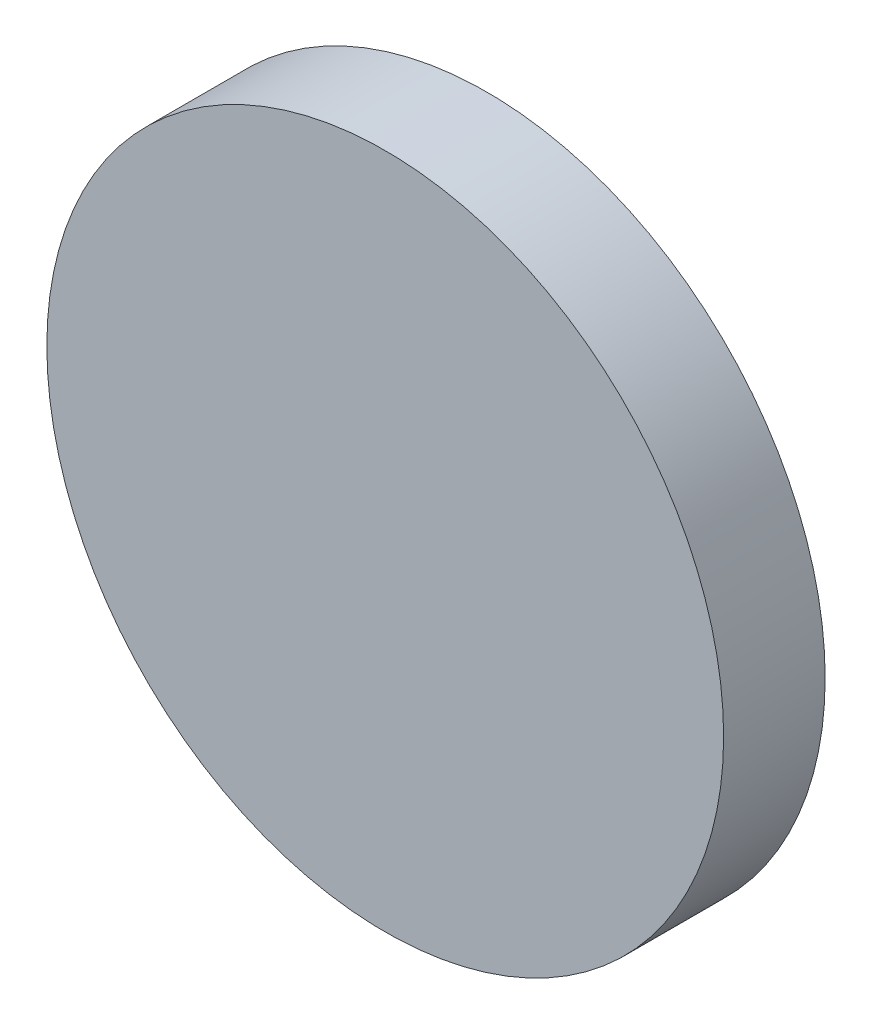
ISO-10303-21;
HEADER;
FILE_DESCRIPTION(('STEP AP214'),'2;1');
FILE_NAME('part.step','',(''),(''),'','','');
FILE_SCHEMA(('AUTOMOTIVE_DESIGN { 1 0 10303 214 1 1 1 1 }'));
ENDSEC;
DATA;
#1=APPLICATION_CONTEXT('core data for automotive mechanical design processes');
#2=APPLICATION_PROTOCOL_DEFINITION('international standard','automotive_design',2000,#1);
#3=PRODUCT_CONTEXT('',#1,'mechanical');
#4=PRODUCT('Part','Part','',(#3));
#5=PRODUCT_RELATED_PRODUCT_CATEGORY('part','',(#4));
#6=PRODUCT_DEFINITION_FORMATION('','',#4);
#7=PRODUCT_DEFINITION_CONTEXT('part definition',#1,'design');
#8=PRODUCT_DEFINITION('design','',#6,#7);
#9=PRODUCT_DEFINITION_SHAPE('','',#8);
#10=(LENGTH_UNIT() NAMED_UNIT(*) SI_UNIT(.MILLI.,.METRE.));
#11=(NAMED_UNIT(*) PLANE_ANGLE_UNIT() SI_UNIT($,.RADIAN.));
#12=(NAMED_UNIT(*) SI_UNIT($,.STERADIAN.) SOLID_ANGLE_UNIT());
#13=UNCERTAINTY_MEASURE_WITH_UNIT(LENGTH_MEASURE(1.E-05),#10,'distance_accuracy_value','');
#14=(GEOMETRIC_REPRESENTATION_CONTEXT(3) GLOBAL_UNCERTAINTY_ASSIGNED_CONTEXT((#13)) GLOBAL_UNIT_ASSIGNED_CONTEXT((#10,
#11,#12)) REPRESENTATION_CONTEXT('',''));
#15=CARTESIAN_POINT('',(0.,0.,0.));
#16=DIRECTION('',(0.,0.,1.));
#17=DIRECTION('',(1.,0.,0.));
#18=AXIS2_PLACEMENT_3D('',#15,#16,#17);
#19=CARTESIAN_POINT('',(0.,0.,0.6));
#20=DIRECTION('',(0.,0.,-1.));
#21=DIRECTION('',(-1.,0.,0.));
#22=AXIS2_PLACEMENT_3D('',#19,#20,#21);
#23=CYLINDRICAL_SURFACE('',#22,2.);
#24=CARTESIAN_POINT('',(0.,0.,0.6));
#25=DIRECTION('',(0.,0.,1.));
#26=DIRECTION('',(1.,0.,0.));
#27=AXIS2_PLACEMENT_3D('',#24,#25,#26);
#28=CIRCLE('',#27,2.);
#29=CARTESIAN_POINT('',(2.,0.,0.6));
#30=VERTEX_POINT('',#29);
#31=EDGE_CURVE('E10',#30,#30,#28,.T.);
#32=ORIENTED_EDGE('',*,*,#31,.F.);
#33=EDGE_LOOP('',(#32));
#34=FACE_BOUND('',#33,.T.);
#35=CARTESIAN_POINT('',(0.,0.,0.));
#36=DIRECTION('',(0.,0.,1.));
#37=DIRECTION('',(1.,0.,0.));
#38=AXIS2_PLACEMENT_3D('',#35,#36,#37);
#39=CIRCLE('',#38,2.);
#40=CARTESIAN_POINT('',(2.,0.,0.));
#41=VERTEX_POINT('',#40);
#42=EDGE_CURVE('E42',#41,#41,#39,.T.);
#43=ORIENTED_EDGE('',*,*,#42,.T.);
#44=EDGE_LOOP('',(#43));
#45=FACE_BOUND('',#44,.T.);
#46=ADVANCED_FACE('F39',(#34,#45),#23,.T.);
#47=CARTESIAN_POINT('',(0.,0.,0.6));
#48=DIRECTION('',(0.,0.,1.));
#49=DIRECTION('',(1.,0.,0.));
#50=AXIS2_PLACEMENT_3D('',#47,#48,#49);
#51=PLANE('',#50);
#52=ORIENTED_EDGE('',*,*,#31,.T.);
#53=EDGE_LOOP('',(#52));
#54=FACE_BOUND('',#53,.T.);
#55=ADVANCED_FACE('F54',(#54),#51,.T.);
#56=CARTESIAN_POINT('',(0.,0.,0.));
#57=DIRECTION('',(0.,0.,1.));
#58=DIRECTION('',(1.,0.,0.));
#59=AXIS2_PLACEMENT_3D('',#56,#57,#58);
#60=PLANE('',#59);
#61=ORIENTED_EDGE('',*,*,#42,.F.);
#62=EDGE_LOOP('',(#61));
#63=FACE_BOUND('',#62,.T.);
#64=ADVANCED_FACE('F52',(#63),#60,.F.);
#65=CLOSED_SHELL('',(#46,#55,#64));
#66=MANIFOLD_SOLID_BREP('B2',#65);
#67=ADVANCED_BREP_SHAPE_REPRESENTATION('',(#18,#66),#14);
#68=SHAPE_DEFINITION_REPRESENTATION(#9,#67);
ENDSEC;
END-ISO-10303-21;
